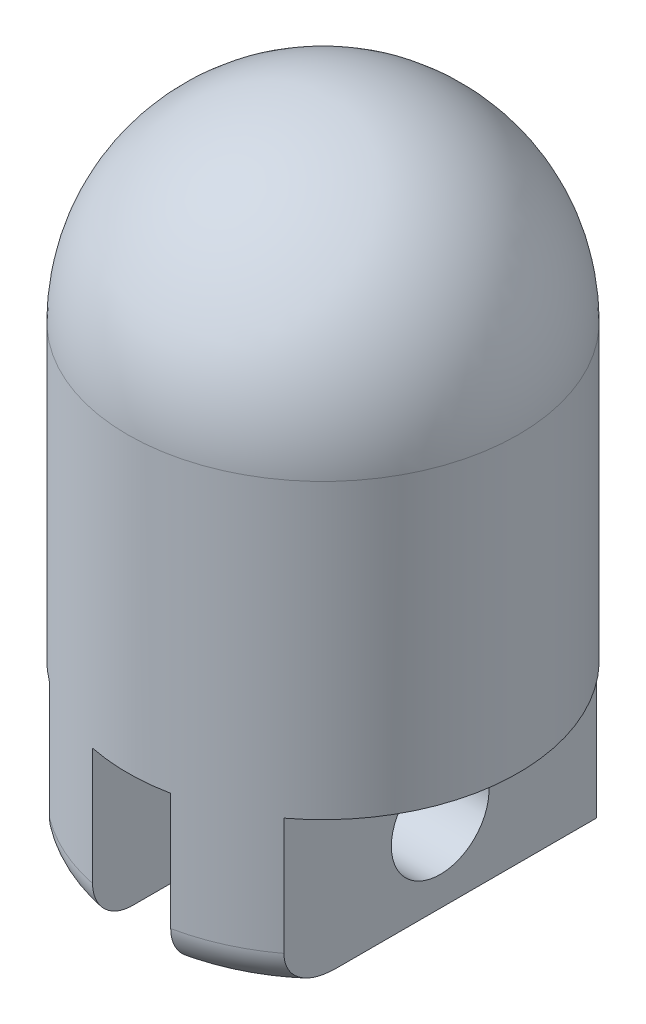
ISO-10303-21;
HEADER;
FILE_DESCRIPTION(('STEP AP214'),'2;1');
FILE_NAME('part.step','',(''),(''),'','','');
FILE_SCHEMA(('AUTOMOTIVE_DESIGN { 1 0 10303 214 1 1 1 1 }'));
ENDSEC;
DATA;
#1=APPLICATION_CONTEXT('core data for automotive mechanical design processes');
#2=APPLICATION_PROTOCOL_DEFINITION('international standard','automotive_design',2000,#1);
#3=PRODUCT_CONTEXT('',#1,'mechanical');
#4=PRODUCT('Part','Part','',(#3));
#5=PRODUCT_RELATED_PRODUCT_CATEGORY('part','',(#4));
#6=PRODUCT_DEFINITION_FORMATION('','',#4);
#7=PRODUCT_DEFINITION_CONTEXT('part definition',#1,'design');
#8=PRODUCT_DEFINITION('design','',#6,#7);
#9=PRODUCT_DEFINITION_SHAPE('','',#8);
#10=(LENGTH_UNIT() NAMED_UNIT(*) SI_UNIT(.MILLI.,.METRE.));
#11=(NAMED_UNIT(*) PLANE_ANGLE_UNIT() SI_UNIT($,.RADIAN.));
#12=(NAMED_UNIT(*) SI_UNIT($,.STERADIAN.) SOLID_ANGLE_UNIT());
#13=UNCERTAINTY_MEASURE_WITH_UNIT(LENGTH_MEASURE(1.E-05),#10,'distance_accuracy_value','');
#14=(GEOMETRIC_REPRESENTATION_CONTEXT(3) GLOBAL_UNCERTAINTY_ASSIGNED_CONTEXT((#13)) GLOBAL_UNIT_ASSIGNED_CONTEXT((#10,
#11,#12)) REPRESENTATION_CONTEXT('',''));
#15=CARTESIAN_POINT('',(0.,0.,0.));
#16=DIRECTION('',(0.,0.,1.));
#17=DIRECTION('',(1.,0.,0.));
#18=AXIS2_PLACEMENT_3D('',#15,#16,#17);
#19=CARTESIAN_POINT('',(0.,0.,0.));
#20=DIRECTION('',(0.,1.,0.));
#21=DIRECTION('',(0.,0.,1.));
#22=AXIS2_PLACEMENT_3D('',#19,#20,#21);
#23=PLANE('',#22);
#24=DIRECTION('',(0.,0.,-1.));
#25=VECTOR('',#24,1.);
#26=CARTESIAN_POINT('',(7.62,0.,10.16));
#27=LINE('',#26,#25);
#28=CARTESIAN_POINT('',(7.62,0.,6.72020833010405));
#29=VERTEX_POINT('',#28);
#30=CARTESIAN_POINT('',(7.62,0.,-10.16));
#31=VERTEX_POINT('',#30);
#32=EDGE_CURVE('E163',#29,#31,#27,.T.);
#33=ORIENTED_EDGE('',*,*,#32,.F.);
#34=CARTESIAN_POINT('',(0.,0.,0.));
#35=DIRECTION('',(0.,1.,0.));
#36=DIRECTION('',(0.,0.,1.));
#37=AXIS2_PLACEMENT_3D('',#34,#35,#36);
#38=CIRCLE('',#37,10.16);
#39=CARTESIAN_POINT('',(2.54,0.,9.83737769936684));
#40=VERTEX_POINT('',#39);
#41=EDGE_CURVE('E285',#29,#40,#38,.F.);
#42=ORIENTED_EDGE('',*,*,#41,.T.);
#43=DIRECTION('',(0.,0.,1.));
#44=VECTOR('',#43,1.);
#45=CARTESIAN_POINT('',(2.54,0.,12.4434078933385));
#46=LINE('',#45,#44);
#47=CARTESIAN_POINT('',(2.54,0.,-12.4434078933385));
#48=VERTEX_POINT('',#47);
#49=EDGE_CURVE('E181',#48,#40,#46,.T.);
#50=ORIENTED_EDGE('',*,*,#49,.F.);
#51=CARTESIAN_POINT('',(0.,0.,0.));
#52=DIRECTION('',(0.,-1.,0.));
#53=DIRECTION('',(0.,0.,-1.));
#54=AXIS2_PLACEMENT_3D('',#51,#52,#53);
#55=CIRCLE('',#54,12.7);
#56=EDGE_CURVE('E212',#48,#31,#55,.T.);
#57=ORIENTED_EDGE('',*,*,#56,.T.);
#58=EDGE_LOOP('',(#33,#42,#50,#57));
#59=FACE_BOUND('',#58,.T.);
#60=ADVANCED_FACE('F39',(#59),#23,.F.);
#61=DIRECTION('',(0.,0.,-1.));
#62=VECTOR('',#61,1.);
#63=CARTESIAN_POINT('',(-2.54,0.,12.4434078933385));
#64=LINE('',#63,#62);
#65=CARTESIAN_POINT('',(-2.54,0.,9.83737769936684));
#66=VERTEX_POINT('',#65);
#67=CARTESIAN_POINT('',(-2.54,0.,-12.4434078933385));
#68=VERTEX_POINT('',#67);
#69=EDGE_CURVE('E155',#66,#68,#64,.T.);
#70=ORIENTED_EDGE('',*,*,#69,.F.);
#71=CARTESIAN_POINT('',(0.,0.,0.));
#72=DIRECTION('',(0.,1.,0.));
#73=DIRECTION('',(0.,0.,1.));
#74=AXIS2_PLACEMENT_3D('',#71,#72,#73);
#75=CIRCLE('',#74,10.16);
#76=CARTESIAN_POINT('',(-7.62,0.,6.72020833010406));
#77=VERTEX_POINT('',#76);
#78=EDGE_CURVE('E234',#66,#77,#75,.F.);
#79=ORIENTED_EDGE('',*,*,#78,.T.);
#80=DIRECTION('',(0.,0.,1.));
#81=VECTOR('',#80,1.);
#82=CARTESIAN_POINT('',(-7.62,0.,10.16));
#83=LINE('',#82,#81);
#84=CARTESIAN_POINT('',(-7.62,0.,-10.16));
#85=VERTEX_POINT('',#84);
#86=EDGE_CURVE('E136',#85,#77,#83,.T.);
#87=ORIENTED_EDGE('',*,*,#86,.F.);
#88=EDGE_CURVE('E151',#85,#68,#55,.T.);
#89=ORIENTED_EDGE('',*,*,#88,.T.);
#90=EDGE_LOOP('',(#70,#79,#87,#89));
#91=FACE_BOUND('',#90,.T.);
#92=ADVANCED_FACE('F337',(#91),#23,.F.);
#93=CARTESIAN_POINT('',(0.,29.21,0.));
#94=DIRECTION('',(0.,-1.,0.));
#95=DIRECTION('',(-1.,0.,0.));
#96=AXIS2_PLACEMENT_3D('',#93,#94,#95);
#97=SPHERICAL_SURFACE('',#96,12.7);
#98=CARTESIAN_POINT('',(0.,29.21,0.));
#99=DIRECTION('',(0.,-1.,0.));
#100=DIRECTION('',(0.,0.,-1.));
#101=AXIS2_PLACEMENT_3D('',#98,#99,#100);
#102=CIRCLE('',#101,12.7);
#103=CARTESIAN_POINT('',(0.,29.21,-12.7));
#104=VERTEX_POINT('',#103);
#105=EDGE_CURVE('E216',#104,#104,#102,.T.);
#106=ORIENTED_EDGE('',*,*,#105,.F.);
#107=EDGE_LOOP('',(#106));
#108=FACE_BOUND('',#107,.T.);
#109=ADVANCED_FACE('F341',(#108),#97,.T.);
#110=CARTESIAN_POINT('',(0.,0.,0.));
#111=DIRECTION('',(0.,-1.,0.));
#112=DIRECTION('',(0.,0.,-1.));
#113=AXIS2_PLACEMENT_3D('',#110,#111,#112);
#114=CYLINDRICAL_SURFACE('',#113,12.7);
#115=DIRECTION('',(0.,-1.,0.));
#116=VECTOR('',#115,1.);
#117=CARTESIAN_POINT('',(-7.62,10.16,10.16));
#118=LINE('',#117,#116);
#119=CARTESIAN_POINT('',(-7.62,10.16,10.16));
#120=VERTEX_POINT('',#119);
#121=CARTESIAN_POINT('',(-7.62,2.54,10.16));
#122=VERTEX_POINT('',#121);
#123=EDGE_CURVE('E143',#120,#122,#118,.T.);
#124=ORIENTED_EDGE('',*,*,#123,.T.);
#125=CARTESIAN_POINT('',(0.,2.54,0.));
#126=DIRECTION('',(0.,1.,0.));
#127=DIRECTION('',(0.,0.,1.));
#128=AXIS2_PLACEMENT_3D('',#125,#126,#127);
#129=CIRCLE('',#128,12.7);
#130=CARTESIAN_POINT('',(-2.54,2.54,12.4434078933385));
#131=VERTEX_POINT('',#130);
#132=EDGE_CURVE('E294',#122,#131,#129,.T.);
#133=ORIENTED_EDGE('',*,*,#132,.T.);
#134=DIRECTION('',(0.,-1.,0.));
#135=VECTOR('',#134,1.);
#136=CARTESIAN_POINT('',(-2.54,10.16,12.4434078933385));
#137=LINE('',#136,#135);
#138=CARTESIAN_POINT('',(-2.54,10.16,12.4434078933385));
#139=VERTEX_POINT('',#138);
#140=EDGE_CURVE('E193',#139,#131,#137,.T.);
#141=ORIENTED_EDGE('',*,*,#140,.F.);
#142=CARTESIAN_POINT('',(0.,10.16,0.));
#143=DIRECTION('',(0.,-1.,0.));
#144=DIRECTION('',(0.,0.,-1.));
#145=AXIS2_PLACEMENT_3D('',#142,#143,#144);
#146=CIRCLE('',#145,12.7);
#147=CARTESIAN_POINT('',(2.54,10.16,12.4434078933385));
#148=VERTEX_POINT('',#147);
#149=EDGE_CURVE('E176',#148,#139,#146,.T.);
#150=ORIENTED_EDGE('',*,*,#149,.F.);
#151=DIRECTION('',(0.,-1.,0.));
#152=VECTOR('',#151,1.);
#153=CARTESIAN_POINT('',(2.54,10.16,12.4434078933385));
#154=LINE('',#153,#152);
#155=CARTESIAN_POINT('',(2.54,2.54,12.4434078933385));
#156=VERTEX_POINT('',#155);
#157=EDGE_CURVE('E199',#148,#156,#154,.T.);
#158=ORIENTED_EDGE('',*,*,#157,.T.);
#159=CARTESIAN_POINT('',(0.,2.54,0.));
#160=DIRECTION('',(0.,1.,0.));
#161=DIRECTION('',(0.,0.,1.));
#162=AXIS2_PLACEMENT_3D('',#159,#160,#161);
#163=CIRCLE('',#162,12.7);
#164=CARTESIAN_POINT('',(7.62,2.54,10.16));
#165=VERTEX_POINT('',#164);
#166=EDGE_CURVE('E246',#156,#165,#163,.T.);
#167=ORIENTED_EDGE('',*,*,#166,.T.);
#168=DIRECTION('',(0.,-1.,0.));
#169=VECTOR('',#168,1.);
#170=CARTESIAN_POINT('',(7.62,10.16,10.16));
#171=LINE('',#170,#169);
#172=CARTESIAN_POINT('',(7.62,10.16,10.16));
#173=VERTEX_POINT('',#172);
#174=EDGE_CURVE('E166',#173,#165,#171,.T.);
#175=ORIENTED_EDGE('',*,*,#174,.F.);
#176=CARTESIAN_POINT('',(0.,10.16,0.));
#177=DIRECTION('',(0.,-1.,0.));
#178=DIRECTION('',(0.,0.,-1.));
#179=AXIS2_PLACEMENT_3D('',#176,#177,#178);
#180=CIRCLE('',#179,12.7);
#181=CARTESIAN_POINT('',(7.62,10.16,-10.16));
#182=VERTEX_POINT('',#181);
#183=EDGE_CURVE('E159',#182,#173,#180,.T.);
#184=ORIENTED_EDGE('',*,*,#183,.F.);
#185=DIRECTION('',(0.,-1.,0.));
#186=VECTOR('',#185,1.);
#187=CARTESIAN_POINT('',(7.62,10.16,-10.16));
#188=LINE('',#187,#186);
#189=EDGE_CURVE('E170',#182,#31,#188,.T.);
#190=ORIENTED_EDGE('',*,*,#189,.T.);
#191=ORIENTED_EDGE('',*,*,#56,.F.);
#192=DIRECTION('',(0.,-1.,0.));
#193=VECTOR('',#192,1.);
#194=CARTESIAN_POINT('',(2.54,10.16,-12.4434078933385));
#195=LINE('',#194,#193);
#196=CARTESIAN_POINT('',(2.54,10.16,-12.4434078933385));
#197=VERTEX_POINT('',#196);
#198=EDGE_CURVE('E203',#197,#48,#195,.T.);
#199=ORIENTED_EDGE('',*,*,#198,.F.);
#200=CARTESIAN_POINT('',(0.,10.16,0.));
#201=DIRECTION('',(0.,-1.,0.));
#202=DIRECTION('',(0.,0.,-1.));
#203=AXIS2_PLACEMENT_3D('',#200,#201,#202);
#204=CIRCLE('',#203,12.7);
#205=CARTESIAN_POINT('',(-2.54,10.16,-12.4434078933385));
#206=VERTEX_POINT('',#205);
#207=EDGE_CURVE('E186',#206,#197,#204,.T.);
#208=ORIENTED_EDGE('',*,*,#207,.F.);
#209=DIRECTION('',(0.,-1.,0.));
#210=VECTOR('',#209,1.);
#211=CARTESIAN_POINT('',(-2.54,10.16,-12.4434078933385));
#212=LINE('',#211,#210);
#213=EDGE_CURVE('E206',#206,#68,#212,.T.);
#214=ORIENTED_EDGE('',*,*,#213,.T.);
#215=ORIENTED_EDGE('',*,*,#88,.F.);
#216=DIRECTION('',(0.,-1.,0.));
#217=VECTOR('',#216,1.);
#218=CARTESIAN_POINT('',(-7.62,10.16,-10.16));
#219=LINE('',#218,#217);
#220=CARTESIAN_POINT('',(-7.62,10.16,-10.16));
#221=VERTEX_POINT('',#220);
#222=EDGE_CURVE('E141',#221,#85,#219,.T.);
#223=ORIENTED_EDGE('',*,*,#222,.F.);
#224=CARTESIAN_POINT('',(0.,10.16,0.));
#225=DIRECTION('',(0.,-1.,0.));
#226=DIRECTION('',(0.,0.,-1.));
#227=AXIS2_PLACEMENT_3D('',#224,#225,#226);
#228=CIRCLE('',#227,12.7);
#229=EDGE_CURVE('E127',#120,#221,#228,.T.);
#230=ORIENTED_EDGE('',*,*,#229,.F.);
#231=EDGE_LOOP('',(#124,#133,#141,#150,#158,#167,#175,#184,#190,#191,#199,#208,#214,#215,#223,#230));
#232=FACE_BOUND('',#231,.T.);
#233=ORIENTED_EDGE('',*,*,#105,.T.);
#234=EDGE_LOOP('',(#233));
#235=FACE_BOUND('',#234,.T.);
#236=ADVANCED_FACE('F147',(#232,#235),#114,.T.);
#237=CARTESIAN_POINT('',(0.,10.16,0.));
#238=DIRECTION('',(0.,-1.,0.));
#239=DIRECTION('',(0.,0.,-1.));
#240=AXIS2_PLACEMENT_3D('',#237,#238,#239);
#241=PLANE('',#240);
#242=CARTESIAN_POINT('',(0.,10.16,0.));
#243=DIRECTION('',(0.,-1.,0.));
#244=DIRECTION('',(0.,0.,-1.));
#245=AXIS2_PLACEMENT_3D('',#242,#243,#244);
#246=CIRCLE('',#245,2.54);
#247=CARTESIAN_POINT('',(-2.54,10.16,0.));
#248=VERTEX_POINT('',#247);
#249=CARTESIAN_POINT('',(2.54,10.16,0.));
#250=VERTEX_POINT('',#249);
#251=EDGE_CURVE('E227',#248,#250,#246,.F.);
#252=ORIENTED_EDGE('',*,*,#251,.T.);
#253=DIRECTION('',(0.,0.,1.));
#254=VECTOR('',#253,1.);
#255=CARTESIAN_POINT('',(2.54,10.16,12.4434078933385));
#256=LINE('',#255,#254);
#257=EDGE_CURVE('E189',#250,#148,#256,.T.);
#258=ORIENTED_EDGE('',*,*,#257,.T.);
#259=ORIENTED_EDGE('',*,*,#149,.T.);
#260=DIRECTION('',(0.,0.,-1.));
#261=VECTOR('',#260,1.);
#262=CARTESIAN_POINT('',(-2.54,10.16,12.4434078933385));
#263=LINE('',#262,#261);
#264=EDGE_CURVE('E182',#139,#248,#263,.T.);
#265=ORIENTED_EDGE('',*,*,#264,.T.);
#266=EDGE_LOOP('',(#252,#258,#259,#265));
#267=FACE_BOUND('',#266,.T.);
#268=ADVANCED_FACE('F267',(#267),#241,.T.);
#269=EDGE_CURVE('E224',#250,#248,#246,.F.);
#270=ORIENTED_EDGE('',*,*,#269,.T.);
#271=EDGE_CURVE('E180',#248,#206,#263,.T.);
#272=ORIENTED_EDGE('',*,*,#271,.T.);
#273=ORIENTED_EDGE('',*,*,#207,.T.);
#274=EDGE_CURVE('E190',#197,#250,#256,.T.);
#275=ORIENTED_EDGE('',*,*,#274,.T.);
#276=EDGE_LOOP('',(#270,#272,#273,#275));
#277=FACE_BOUND('',#276,.T.);
#278=ADVANCED_FACE('F270',(#277),#241,.T.);
#279=CARTESIAN_POINT('',(2.54,10.16,12.4434078933385));
#280=DIRECTION('',(1.,0.,0.));
#281=DIRECTION('',(0.,0.,-1.));
#282=AXIS2_PLACEMENT_3D('',#279,#280,#281);
#283=PLANE('',#282);
#284=CARTESIAN_POINT('',(2.54,5.08,0.));
#285=DIRECTION('',(1.,0.,0.));
#286=DIRECTION('',(0.,0.,-1.));
#287=AXIS2_PLACEMENT_3D('',#284,#285,#286);
#288=CIRCLE('',#287,3.175);
#289=CARTESIAN_POINT('',(2.54,5.08,-3.175));
#290=VERTEX_POINT('',#289);
#291=EDGE_CURVE('E169',#290,#290,#288,.T.);
#292=ORIENTED_EDGE('',*,*,#291,.T.);
#293=EDGE_LOOP('',(#292));
#294=FACE_BOUND('',#293,.T.);
#295=ORIENTED_EDGE('',*,*,#49,.T.);
#296=CARTESIAN_POINT('',(2.54,0.,9.83737769936684));
#297=CARTESIAN_POINT('',(2.54,1.45425618167772E-06,9.91230037919097));
#298=CARTESIAN_POINT('',(2.54,0.00310981694239159,9.98718958698183));
#299=CARTESIAN_POINT('',(2.54,0.0155436658062321,10.1364549391743));
#300=CARTESIAN_POINT('',(2.54,0.02486959755277,10.2108310464197));
#301=CARTESIAN_POINT('',(2.54,0.0621632906921143,10.4324166619154));
#302=CARTESIAN_POINT('',(2.54,0.0994469487679672,10.578173392806));
#303=CARTESIAN_POINT('',(2.54,0.198147270173078,10.8613867869284));
#304=CARTESIAN_POINT('',(2.54,0.259589645281355,10.9988344265028));
#305=CARTESIAN_POINT('',(2.54,0.405105398356876,11.261129326273));
#306=CARTESIAN_POINT('',(2.54,0.48916633258982,11.3859834630861));
#307=CARTESIAN_POINT('',(2.54,0.675862847898282,11.6169487416195));
#308=CARTESIAN_POINT('',(2.54,0.778107822291197,11.7233756291323));
#309=CARTESIAN_POINT('',(2.54,0.999446084232905,11.9170573290163));
#310=CARTESIAN_POINT('',(2.54,1.11854228435804,12.0043088204298));
#311=CARTESIAN_POINT('',(2.54,1.36703211456297,12.1549133561521));
#312=CARTESIAN_POINT('',(2.54,1.49610667508061,12.2187937971196));
#313=CARTESIAN_POINT('',(2.54,1.76323440237714,12.3234975537076));
#314=CARTESIAN_POINT('',(2.54,1.90127928169638,12.3643418234144));
#315=CARTESIAN_POINT('',(2.54,2.12369890518237,12.4097791905788));
#316=CARTESIAN_POINT('',(2.54,2.20651763910892,12.4223841804546));
#317=CARTESIAN_POINT('',(2.54,2.37287781294579,12.4391952140899));
#318=CARTESIAN_POINT('',(2.54,2.45641798662608,12.4434137919833));
#319=CARTESIAN_POINT('',(2.54,2.54,12.4434078933385));
#320=B_SPLINE_CURVE_WITH_KNOTS('',3,(#296,#297,#298,#299,#300,#301,#302,#303,#304,#305,#306,
#307,#308,#309,#310,#311,#312,#313,#314,#315,#316,#317,#318,#319),.UNSPECIFIED.,.F.,.F.,(4,2,2,
2,2,2,2,2,2,2,2,4),(0.,0.224635584073767,0.449287267911123,0.898324217122332,1.34784036920845,
1.79710972118426,2.23769161945873,2.67834976141615,3.10834056745386,3.53793961324235,
3.78887256919796,4.0394302038591),.UNSPECIFIED.);
#321=EDGE_CURVE('E54',#40,#156,#320,.T.);
#322=ORIENTED_EDGE('',*,*,#321,.T.);
#323=ORIENTED_EDGE('',*,*,#157,.F.);
#324=ORIENTED_EDGE('',*,*,#257,.F.);
#325=ORIENTED_EDGE('',*,*,#274,.F.);
#326=ORIENTED_EDGE('',*,*,#198,.T.);
#327=EDGE_LOOP('',(#295,#322,#323,#324,#325,#326));
#328=FACE_BOUND('',#327,.T.);
#329=ADVANCED_FACE('F272',(#294,#328),#283,.F.);
#330=CARTESIAN_POINT('',(-2.54,10.16,12.4434078933385));
#331=DIRECTION('',(-1.,0.,0.));
#332=DIRECTION('',(0.,0.,1.));
#333=AXIS2_PLACEMENT_3D('',#330,#331,#332);
#334=PLANE('',#333);
#335=CARTESIAN_POINT('',(-2.54,5.08,0.));
#336=DIRECTION('',(-1.,0.,0.));
#337=DIRECTION('',(0.,0.,1.));
#338=AXIS2_PLACEMENT_3D('',#335,#336,#337);
#339=CIRCLE('',#338,3.175);
#340=CARTESIAN_POINT('',(-2.54,5.08,3.175));
#341=VERTEX_POINT('',#340);
#342=EDGE_CURVE('E232',#341,#341,#339,.T.);
#343=ORIENTED_EDGE('',*,*,#342,.T.);
#344=EDGE_LOOP('',(#343));
#345=FACE_BOUND('',#344,.T.);
#346=ORIENTED_EDGE('',*,*,#140,.T.);
#347=CARTESIAN_POINT('',(-2.54,2.54,12.4434078933385));
#348=CARTESIAN_POINT('',(-2.54,2.46967063237577,12.4434154470113));
#349=CARTESIAN_POINT('',(-2.54,2.39934485357642,12.4404267278602));
#350=CARTESIAN_POINT('',(-2.54,2.25920319252276,12.4285150367311));
#351=CARTESIAN_POINT('',(-2.54,2.18938726943151,12.4195925454082));
#352=CARTESIAN_POINT('',(-2.54,2.0508429922709,12.3958863873355));
#353=CARTESIAN_POINT('',(-2.54,1.98211338963525,12.3811100493502));
#354=CARTESIAN_POINT('',(-2.54,1.84616156852946,12.3458265144606));
#355=CARTESIAN_POINT('',(-2.54,1.77893934087272,12.3253193524927));
#356=CARTESIAN_POINT('',(-2.54,1.58020157604863,12.2553951049839));
#357=CARTESIAN_POINT('',(-2.54,1.45153515102383,12.1975614990708));
#358=CARTESIAN_POINT('',(-2.54,1.20572174178529,12.0613038825231));
#359=CARTESIAN_POINT('',(-2.54,1.08857431180475,11.982880669105));
#360=CARTESIAN_POINT('',(-2.54,0.867990402614351,11.8070995623068));
#361=CARTESIAN_POINT('',(-2.54,0.764664812840586,11.7096023869722));
#362=CARTESIAN_POINT('',(-2.54,0.575468544765382,11.4989271370242));
#363=CARTESIAN_POINT('',(-2.54,0.489601028382851,11.3857462280823));
#364=CARTESIAN_POINT('',(-2.54,0.335940087501158,11.1446164847891));
#365=CARTESIAN_POINT('',(-2.54,0.268530705758163,11.0164232223069));
#366=CARTESIAN_POINT('',(-2.54,0.155607960316393,10.7507343228132));
#367=CARTESIAN_POINT('',(-2.54,0.110091838523056,10.6132398600497));
#368=CARTESIAN_POINT('',(-2.54,0.0506877983667472,10.3690151979483));
#369=CARTESIAN_POINT('',(-2.54,0.0316698297012548,10.2634985640939));
#370=CARTESIAN_POINT('',(-2.54,0.00632611211670065,10.051121449083));
#371=CARTESIAN_POINT('',(-2.54,-1.98484952771332E-05,9.94426338192671));
#372=CARTESIAN_POINT('',(-2.54,0.,9.83737769936684));
#373=B_SPLINE_CURVE_WITH_KNOTS('',3,(#347,#348,#349,#350,#351,#352,#353,#354,#355,#356,#357,
#358,#359,#360,#361,#362,#363,#364,#365,#366,#367,#368,#369,#370,#371,#372),.UNSPECIFIED.,.F.,
.F.,(4,2,2,2,2,2,2,2,2,2,2,2,4),(0.,0.210918249149259,0.421819415305526,0.632457372480104,
0.843094045585046,1.26412750353444,1.68514466173996,2.10935936996745,2.53365084153177,
2.9661951343593,3.39868492133767,3.71960780058626,4.04001840172957),.UNSPECIFIED.);
#374=EDGE_CURVE('E288',#131,#66,#373,.T.);
#375=ORIENTED_EDGE('',*,*,#374,.T.);
#376=ORIENTED_EDGE('',*,*,#69,.T.);
#377=ORIENTED_EDGE('',*,*,#213,.F.);
#378=ORIENTED_EDGE('',*,*,#271,.F.);
#379=ORIENTED_EDGE('',*,*,#264,.F.);
#380=EDGE_LOOP('',(#346,#375,#376,#377,#378,#379));
#381=FACE_BOUND('',#380,.T.);
#382=ADVANCED_FACE('F255',(#345,#381),#334,.F.);
#383=CARTESIAN_POINT('',(-7.62,10.16,10.16));
#384=DIRECTION('',(1.,0.,0.));
#385=DIRECTION('',(0.,0.,-1.));
#386=AXIS2_PLACEMENT_3D('',#383,#384,#385);
#387=PLANE('',#386);
#388=CARTESIAN_POINT('',(-7.62,5.08,0.));
#389=DIRECTION('',(-1.,0.,0.));
#390=DIRECTION('',(0.,0.,1.));
#391=AXIS2_PLACEMENT_3D('',#388,#389,#390);
#392=CIRCLE('',#391,3.175);
#393=CARTESIAN_POINT('',(-7.62,5.08,3.175));
#394=VERTEX_POINT('',#393);
#395=EDGE_CURVE('E233',#394,#394,#392,.T.);
#396=ORIENTED_EDGE('',*,*,#395,.F.);
#397=EDGE_LOOP('',(#396));
#398=FACE_BOUND('',#397,.T.);
#399=ORIENTED_EDGE('',*,*,#86,.T.);
#400=CARTESIAN_POINT('',(-7.62,0.,6.72020833010406));
#401=CARTESIAN_POINT('',(-7.62,-7.47413466262009E-05,6.99327990287421));
#402=CARTESIAN_POINT('',(-7.62,0.0193476233139783,7.26867863347754));
#403=CARTESIAN_POINT('',(-7.62,0.106175815575614,7.81491676110583));
#404=CARTESIAN_POINT('',(-7.62,0.174158048363267,8.08566098800379));
#405=CARTESIAN_POINT('',(-7.62,0.330202589140558,8.50572625033474));
#406=CARTESIAN_POINT('',(-7.62,0.400388070445191,8.66158064871892));
#407=CARTESIAN_POINT('',(-7.62,0.563805608258863,8.96011014989274));
#408=CARTESIAN_POINT('',(-7.62,0.656936899856236,9.10283922552907));
#409=CARTESIAN_POINT('',(-7.62,0.849628854295138,9.34773236899358));
#410=CARTESIAN_POINT('',(-7.62,0.94560747612532,9.45270636094602));
#411=CARTESIAN_POINT('',(-7.62,1.15378585705436,9.64565066826041));
#412=CARTESIAN_POINT('',(-7.62,1.26599581181159,9.73361021427731));
#413=CARTESIAN_POINT('',(-7.62,1.44529437515778,9.84952483403398));
#414=CARTESIAN_POINT('',(-7.62,1.50721950643727,9.88562806891205));
#415=CARTESIAN_POINT('',(-7.62,1.63422624334214,9.95174325933018));
#416=CARTESIAN_POINT('',(-7.62,1.69930608040803,9.98175857998488));
#417=CARTESIAN_POINT('',(-7.62,1.83201255255219,10.0351448409041));
#418=CARTESIAN_POINT('',(-7.62,1.89963477966944,10.058526730362));
#419=CARTESIAN_POINT('',(-7.62,2.03687651112399,10.0982731683472));
#420=CARTESIAN_POINT('',(-7.62,2.10649472654276,10.1146421412512));
#421=CARTESIAN_POINT('',(-7.62,2.23669220288616,10.1381834984238));
#422=CARTESIAN_POINT('',(-7.62,2.29709235328131,10.1463553862042));
#423=CARTESIAN_POINT('',(-7.62,2.41832511963126,10.157267723823));
#424=CARTESIAN_POINT('',(-7.62,2.47915729303315,10.1600130994335));
#425=CARTESIAN_POINT('',(-7.62,2.54,10.16));
#426=B_SPLINE_CURVE_WITH_KNOTS('',3,(#400,#401,#402,#403,#404,#405,#406,#407,#408,#409,#410,
#411,#412,#413,#414,#415,#416,#417,#418,#419,#420,#421,#422,#423,#424,#425),.UNSPECIFIED.,.F.,
.F.,(4,2,2,2,2,2,2,2,2,2,2,2,4),(0.,0.822329418337463,1.6545856392476,2.16562723963451,
2.67446343320547,3.09953770525556,3.52488015523001,3.73965037300011,3.95430155034069,
4.16859633351735,4.38275572052489,4.5653690206287,4.74781648210551),.UNSPECIFIED.);
#427=EDGE_CURVE('E238',#77,#122,#426,.T.);
#428=ORIENTED_EDGE('',*,*,#427,.T.);
#429=ORIENTED_EDGE('',*,*,#123,.F.);
#430=DIRECTION('',(0.,0.,1.));
#431=VECTOR('',#430,1.);
#432=CARTESIAN_POINT('',(-7.62,10.16,10.16));
#433=LINE('',#432,#431);
#434=EDGE_CURVE('E130',#221,#120,#433,.T.);
#435=ORIENTED_EDGE('',*,*,#434,.F.);
#436=ORIENTED_EDGE('',*,*,#222,.T.);
#437=EDGE_LOOP('',(#399,#428,#429,#435,#436));
#438=FACE_BOUND('',#437,.T.);
#439=ADVANCED_FACE('F140',(#398,#438),#387,.F.);
#440=CARTESIAN_POINT('',(0.,10.16,0.));
#441=DIRECTION('',(0.,-1.,0.));
#442=DIRECTION('',(0.,0.,-1.));
#443=AXIS2_PLACEMENT_3D('',#440,#441,#442);
#444=PLANE('',#443);
#445=ORIENTED_EDGE('',*,*,#229,.T.);
#446=ORIENTED_EDGE('',*,*,#434,.T.);
#447=EDGE_LOOP('',(#445,#446));
#448=FACE_BOUND('',#447,.T.);
#449=ADVANCED_FACE('F129',(#448),#444,.T.);
#450=CARTESIAN_POINT('',(7.62,10.16,10.16));
#451=DIRECTION('',(-1.,0.,0.));
#452=DIRECTION('',(0.,0.,1.));
#453=AXIS2_PLACEMENT_3D('',#450,#451,#452);
#454=PLANE('',#453);
#455=CARTESIAN_POINT('',(7.62,5.08,0.));
#456=DIRECTION('',(-1.,0.,0.));
#457=DIRECTION('',(0.,0.,1.));
#458=AXIS2_PLACEMENT_3D('',#455,#456,#457);
#459=CIRCLE('',#458,3.175);
#460=CARTESIAN_POINT('',(7.62,5.08,3.175));
#461=VERTEX_POINT('',#460);
#462=EDGE_CURVE('E228',#461,#461,#459,.T.);
#463=ORIENTED_EDGE('',*,*,#462,.T.);
#464=EDGE_LOOP('',(#463));
#465=FACE_BOUND('',#464,.T.);
#466=ORIENTED_EDGE('',*,*,#174,.T.);
#467=CARTESIAN_POINT('',(7.62,2.54,10.16));
#468=CARTESIAN_POINT('',(7.62,2.47932871801413,10.160013422572));
#469=CARTESIAN_POINT('',(7.62,2.41866415701389,10.1572831063146));
#470=CARTESIAN_POINT('',(7.62,2.2978418724177,10.1464377967899));
#471=CARTESIAN_POINT('',(7.62,2.2376839558966,10.138324956614));
#472=CARTESIAN_POINT('',(7.62,2.11862855106172,10.1168730079301));
#473=CARTESIAN_POINT('',(7.62,2.05972614470898,10.1035612158783));
#474=CARTESIAN_POINT('',(7.62,1.94330175148668,10.0719120039639));
#475=CARTESIAN_POINT('',(7.62,1.88577984067071,10.0535743079047));
#476=CARTESIAN_POINT('',(7.62,1.71602141232677,9.99141574586202));
#477=CARTESIAN_POINT('',(7.62,1.60633792199534,9.94040237008355));
#478=CARTESIAN_POINT('',(7.62,1.39643687655324,9.82166143509589));
#479=CARTESIAN_POINT('',(7.62,1.29623012032819,9.75391511838246));
#480=CARTESIAN_POINT('',(7.62,1.10140396209762,9.60017195503882));
#481=CARTESIAN_POINT('',(7.62,1.00743968410422,9.51334813782557));
#482=CARTESIAN_POINT('',(7.62,0.832811559060195,9.32739554876275));
#483=CARTESIAN_POINT('',(7.62,0.752146257718205,9.22826812443806));
#484=CARTESIAN_POINT('',(7.62,0.56901035013809,8.97113171733957));
#485=CARTESIAN_POINT('',(7.62,0.474380686677983,8.80751855999478));
#486=CARTESIAN_POINT('',(7.62,0.312580853764836,8.46662437064915));
#487=CARTESIAN_POINT('',(7.62,0.24554814462936,8.28928002390191));
#488=CARTESIAN_POINT('',(7.62,0.123485313346866,7.88241693388359));
#489=CARTESIAN_POINT('',(7.62,0.0755124919327639,7.6508331222634));
#490=CARTESIAN_POINT('',(7.62,0.0139793253253,7.18584265831651));
#491=CARTESIAN_POINT('',(7.62,1.01513079260754E-05,6.95249184834465));
#492=CARTESIAN_POINT('',(7.62,0.,6.72020833010406));
#493=B_SPLINE_CURVE_WITH_KNOTS('',3,(#467,#468,#469,#470,#471,#472,#473,#474,#475,#476,#477,
#478,#479,#480,#481,#482,#483,#484,#485,#486,#487,#488,#489,#490,#491,#492),.UNSPECIFIED.,.F.,
.F.,(4,2,2,2,2,2,2,2,2,2,2,2,4),(0.,0.181941273273647,0.363809811116228,0.544735355538573,
0.725670844648793,1.08677612239183,1.44828804845431,1.83064058095025,2.21295127403603,
2.77684806807466,3.34352060408734,4.05019972676753,4.74833947495295),.UNSPECIFIED.);
#494=EDGE_CURVE('E11',#165,#29,#493,.T.);
#495=ORIENTED_EDGE('',*,*,#494,.T.);
#496=ORIENTED_EDGE('',*,*,#32,.T.);
#497=ORIENTED_EDGE('',*,*,#189,.F.);
#498=DIRECTION('',(0.,0.,-1.));
#499=VECTOR('',#498,1.);
#500=CARTESIAN_POINT('',(7.62,10.16,10.16));
#501=LINE('',#500,#499);
#502=EDGE_CURVE('E162',#173,#182,#501,.T.);
#503=ORIENTED_EDGE('',*,*,#502,.F.);
#504=EDGE_LOOP('',(#466,#495,#496,#497,#503));
#505=FACE_BOUND('',#504,.T.);
#506=ADVANCED_FACE('F261',(#465,#505),#454,.F.);
#507=CARTESIAN_POINT('',(0.,10.16,0.));
#508=DIRECTION('',(0.,-1.,0.));
#509=DIRECTION('',(0.,0.,-1.));
#510=AXIS2_PLACEMENT_3D('',#507,#508,#509);
#511=PLANE('',#510);
#512=ORIENTED_EDGE('',*,*,#183,.T.);
#513=ORIENTED_EDGE('',*,*,#502,.T.);
#514=EDGE_LOOP('',(#512,#513));
#515=FACE_BOUND('',#514,.T.);
#516=ADVANCED_FACE('F258',(#515),#511,.T.);
#517=CARTESIAN_POINT('',(0.,0.,0.));
#518=DIRECTION('',(0.,-1.,0.));
#519=DIRECTION('',(0.,0.,-1.));
#520=AXIS2_PLACEMENT_3D('',#517,#518,#519);
#521=CYLINDRICAL_SURFACE('',#520,2.54);
#522=CARTESIAN_POINT('',(0.,22.86,0.));
#523=DIRECTION('',(0.,-1.,0.));
#524=DIRECTION('',(0.,0.,-1.));
#525=AXIS2_PLACEMENT_3D('',#522,#523,#524);
#526=CIRCLE('',#525,2.54);
#527=CARTESIAN_POINT('',(0.,22.86,-2.54));
#528=VERTEX_POINT('',#527);
#529=EDGE_CURVE('E220',#528,#528,#526,.T.);
#530=ORIENTED_EDGE('',*,*,#529,.F.);
#531=EDGE_LOOP('',(#530));
#532=FACE_BOUND('',#531,.T.);
#533=ORIENTED_EDGE('',*,*,#251,.F.);
#534=ORIENTED_EDGE('',*,*,#269,.F.);
#535=EDGE_LOOP('',(#533,#534));
#536=FACE_BOUND('',#535,.T.);
#537=ADVANCED_FACE('F260',(#532,#536),#521,.F.);
#538=CARTESIAN_POINT('',(0.,29.21,0.));
#539=DIRECTION('',(0.,-1.,0.));
#540=DIRECTION('',(-1.,0.,0.));
#541=AXIS2_PLACEMENT_3D('',#538,#539,#540);
#542=SPHERICAL_SURFACE('',#541,6.83915930506082);
#543=ORIENTED_EDGE('',*,*,#529,.T.);
#544=EDGE_LOOP('',(#543));
#545=FACE_BOUND('',#544,.T.);
#546=ADVANCED_FACE('F326',(#545),#542,.F.);
#547=CARTESIAN_POINT('',(12.7,5.08,0.));
#548=DIRECTION('',(-1.,0.,0.));
#549=DIRECTION('',(0.,0.,1.));
#550=AXIS2_PLACEMENT_3D('',#547,#548,#549);
#551=CYLINDRICAL_SURFACE('',#550,3.175);
#552=ORIENTED_EDGE('',*,*,#462,.F.);
#553=EDGE_LOOP('',(#552));
#554=FACE_BOUND('',#553,.T.);
#555=ORIENTED_EDGE('',*,*,#291,.F.);
#556=EDGE_LOOP('',(#555));
#557=FACE_BOUND('',#556,.T.);
#558=ADVANCED_FACE('F332',(#554,#557),#551,.F.);
#559=ORIENTED_EDGE('',*,*,#395,.T.);
#560=EDGE_LOOP('',(#559));
#561=FACE_BOUND('',#560,.T.);
#562=ORIENTED_EDGE('',*,*,#342,.F.);
#563=EDGE_LOOP('',(#562));
#564=FACE_BOUND('',#563,.T.);
#565=ADVANCED_FACE('F364',(#561,#564),#551,.F.);
#566=CARTESIAN_POINT('',(0.,2.54,0.));
#567=DIRECTION('',(0.,1.,0.));
#568=DIRECTION('',(0.,0.,1.));
#569=AXIS2_PLACEMENT_3D('',#566,#567,#568);
#570=TOROIDAL_SURFACE('',#569,10.16,2.54);
#571=ORIENTED_EDGE('',*,*,#374,.F.);
#572=ORIENTED_EDGE('',*,*,#132,.F.);
#573=ORIENTED_EDGE('',*,*,#427,.F.);
#574=ORIENTED_EDGE('',*,*,#78,.F.);
#575=EDGE_LOOP('',(#571,#572,#573,#574));
#576=FACE_BOUND('',#575,.T.);
#577=ADVANCED_FACE('F248',(#576),#570,.T.);
#578=CARTESIAN_POINT('',(0.,2.54,0.));
#579=DIRECTION('',(0.,1.,0.));
#580=DIRECTION('',(0.,0.,1.));
#581=AXIS2_PLACEMENT_3D('',#578,#579,#580);
#582=TOROIDAL_SURFACE('',#581,10.16,2.54);
#583=ORIENTED_EDGE('',*,*,#494,.F.);
#584=ORIENTED_EDGE('',*,*,#166,.F.);
#585=ORIENTED_EDGE('',*,*,#321,.F.);
#586=ORIENTED_EDGE('',*,*,#41,.F.);
#587=EDGE_LOOP('',(#583,#584,#585,#586));
#588=FACE_BOUND('',#587,.T.);
#589=ADVANCED_FACE('F41',(#588),#582,.T.);
#590=CLOSED_SHELL('',(#60,#92,#109,#236,#268,#278,#329,#382,#439,#449,#506,#516,#537,#546,#558,
#565,#577,#589));
#591=MANIFOLD_SOLID_BREP('B2',#590);
#592=ADVANCED_BREP_SHAPE_REPRESENTATION('',(#18,#591),#14);
#593=SHAPE_DEFINITION_REPRESENTATION(#9,#592);
ENDSEC;
END-ISO-10303-21;
